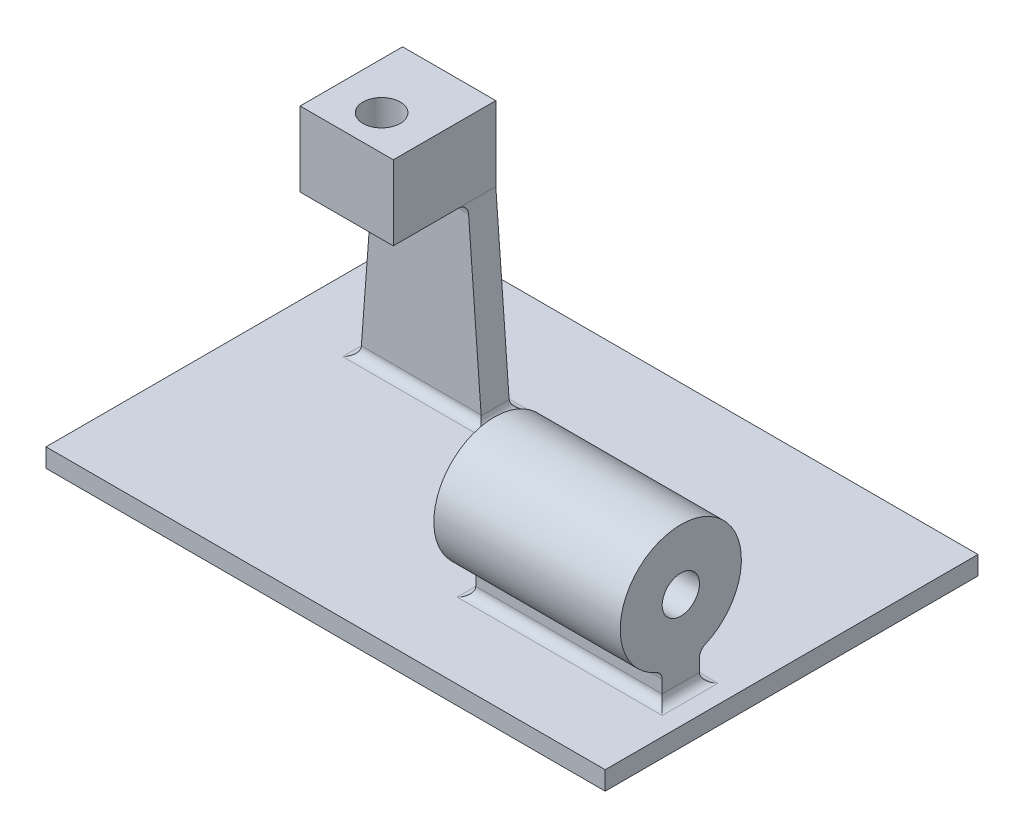
ISO-10303-21;
HEADER;
FILE_DESCRIPTION(('STEP AP214'),'2;1');
FILE_NAME('part.step','',(''),(''),'','','');
FILE_SCHEMA(('AUTOMOTIVE_DESIGN { 1 0 10303 214 1 1 1 1 }'));
ENDSEC;
DATA;
#1=APPLICATION_CONTEXT('core data for automotive mechanical design processes');
#2=APPLICATION_PROTOCOL_DEFINITION('international standard','automotive_design',2000,#1);
#3=PRODUCT_CONTEXT('',#1,'mechanical');
#4=PRODUCT('Part','Part','',(#3));
#5=PRODUCT_RELATED_PRODUCT_CATEGORY('part','',(#4));
#6=PRODUCT_DEFINITION_FORMATION('','',#4);
#7=PRODUCT_DEFINITION_CONTEXT('part definition',#1,'design');
#8=PRODUCT_DEFINITION('design','',#6,#7);
#9=PRODUCT_DEFINITION_SHAPE('','',#8);
#10=(LENGTH_UNIT() NAMED_UNIT(*) SI_UNIT(.MILLI.,.METRE.));
#11=(NAMED_UNIT(*) PLANE_ANGLE_UNIT() SI_UNIT($,.RADIAN.));
#12=(NAMED_UNIT(*) SI_UNIT($,.STERADIAN.) SOLID_ANGLE_UNIT());
#13=UNCERTAINTY_MEASURE_WITH_UNIT(LENGTH_MEASURE(1.E-05),#10,'distance_accuracy_value','');
#14=(GEOMETRIC_REPRESENTATION_CONTEXT(3) GLOBAL_UNCERTAINTY_ASSIGNED_CONTEXT((#13)) GLOBAL_UNIT_ASSIGNED_CONTEXT((#10,
#11,#12)) REPRESENTATION_CONTEXT('',''));
#15=CARTESIAN_POINT('',(0.,0.,0.));
#16=DIRECTION('',(0.,0.,1.));
#17=DIRECTION('',(1.,0.,0.));
#18=AXIS2_PLACEMENT_3D('',#15,#16,#17);
#19=CARTESIAN_POINT('',(0.,0.,-5.30356021786373));
#20=DIRECTION('',(0.,0.,1.));
#21=DIRECTION('',(0.,-1.,0.));
#22=AXIS2_PLACEMENT_3D('',#19,#20,#21);
#23=PLANE('',#22);
#24=DIRECTION('',(0.0747899482416341,-0.997199309888457,0.));
#25=VECTOR('',#24,1.);
#26=CARTESIAN_POINT('',(-10.0406164647511,22.,-5.30356021786373));
#27=LINE('',#26,#25);
#28=CARTESIAN_POINT('',(-9.96561646475105,21.,-5.30356021786373));
#29=VERTEX_POINT('',#28);
#30=CARTESIAN_POINT('',(-8.61561646475106,3.,-5.30356021786373));
#31=VERTEX_POINT('',#30);
#32=EDGE_CURVE('E279',#29,#31,#27,.T.);
#33=ORIENTED_EDGE('',*,*,#32,.F.);
#34=DIRECTION('',(1.,0.,0.));
#35=VECTOR('',#34,1.);
#36=CARTESIAN_POINT('',(0.,21.,-5.30356021786373));
#37=LINE('',#36,#35);
#38=CARTESIAN_POINT('',(-20.115616464751,21.,-5.30356021786373));
#39=VERTEX_POINT('',#38);
#40=EDGE_CURVE('E283',#29,#39,#37,.F.);
#41=ORIENTED_EDGE('',*,*,#40,.T.);
#42=DIRECTION('',(-0.0747899482416345,-0.997199309888457,0.));
#43=VECTOR('',#42,1.);
#44=CARTESIAN_POINT('',(-20.0406164647511,22.,-5.30356021786373));
#45=LINE('',#44,#43);
#46=CARTESIAN_POINT('',(-21.4656164647511,3.,-5.30356021786373));
#47=VERTEX_POINT('',#46);
#48=EDGE_CURVE('E271',#39,#47,#45,.T.);
#49=ORIENTED_EDGE('',*,*,#48,.T.);
#50=DIRECTION('',(1.,0.,0.));
#51=VECTOR('',#50,1.);
#52=CARTESIAN_POINT('',(0.,3.,-5.30356021786373));
#53=LINE('',#52,#51);
#54=EDGE_CURVE('E371',#47,#31,#53,.T.);
#55=ORIENTED_EDGE('',*,*,#54,.T.);
#56=EDGE_LOOP('',(#33,#41,#49,#55));
#57=FACE_BOUND('',#56,.T.);
#58=ADVANCED_FACE('F49',(#57),#23,.T.);
#59=CARTESIAN_POINT('',(30.,2.,20.));
#60=DIRECTION('',(-1.,0.,0.));
#61=DIRECTION('',(0.,0.,1.));
#62=AXIS2_PLACEMENT_3D('',#59,#60,#61);
#63=PLANE('',#62);
#64=DIRECTION('',(0.,0.,-1.));
#65=VECTOR('',#64,1.);
#66=CARTESIAN_POINT('',(30.,0.,20.));
#67=LINE('',#66,#65);
#68=CARTESIAN_POINT('',(30.,0.,20.));
#69=VERTEX_POINT('',#68);
#70=CARTESIAN_POINT('',(30.,0.,-20.));
#71=VERTEX_POINT('',#70);
#72=EDGE_CURVE('E282',#69,#71,#67,.T.);
#73=ORIENTED_EDGE('',*,*,#72,.T.);
#74=DIRECTION('',(0.,-1.,0.));
#75=VECTOR('',#74,1.);
#76=CARTESIAN_POINT('',(30.,2.,-20.));
#77=LINE('',#76,#75);
#78=CARTESIAN_POINT('',(30.,2.,-20.));
#79=VERTEX_POINT('',#78);
#80=EDGE_CURVE('E352',#79,#71,#77,.T.);
#81=ORIENTED_EDGE('',*,*,#80,.F.);
#82=DIRECTION('',(0.,0.,-1.));
#83=VECTOR('',#82,1.);
#84=CARTESIAN_POINT('',(30.,2.,20.));
#85=LINE('',#84,#83);
#86=CARTESIAN_POINT('',(30.,2.,20.));
#87=VERTEX_POINT('',#86);
#88=EDGE_CURVE('E545',#87,#79,#85,.T.);
#89=ORIENTED_EDGE('',*,*,#88,.F.);
#90=DIRECTION('',(0.,-1.,0.));
#91=VECTOR('',#90,1.);
#92=CARTESIAN_POINT('',(30.,2.,20.));
#93=LINE('',#92,#91);
#94=EDGE_CURVE('E737',#87,#69,#93,.T.);
#95=ORIENTED_EDGE('',*,*,#94,.T.);
#96=EDGE_LOOP('',(#73,#81,#89,#95));
#97=FACE_BOUND('',#96,.T.);
#98=ADVANCED_FACE('F558',(#97),#63,.F.);
#99=CARTESIAN_POINT('',(-30.,2.,-20.));
#100=DIRECTION('',(0.,0.,1.));
#101=DIRECTION('',(1.,0.,0.));
#102=AXIS2_PLACEMENT_3D('',#99,#100,#101);
#103=PLANE('',#102);
#104=DIRECTION('',(-1.,0.,0.));
#105=VECTOR('',#104,1.);
#106=CARTESIAN_POINT('',(-30.,0.,-20.));
#107=LINE('',#106,#105);
#108=CARTESIAN_POINT('',(-30.,0.,-20.));
#109=VERTEX_POINT('',#108);
#110=EDGE_CURVE('E724',#71,#109,#107,.T.);
#111=ORIENTED_EDGE('',*,*,#110,.T.);
#112=DIRECTION('',(0.,-1.,0.));
#113=VECTOR('',#112,1.);
#114=CARTESIAN_POINT('',(-30.,2.,-20.));
#115=LINE('',#114,#113);
#116=CARTESIAN_POINT('',(-30.,2.,-20.));
#117=VERTEX_POINT('',#116);
#118=EDGE_CURVE('E562',#117,#109,#115,.T.);
#119=ORIENTED_EDGE('',*,*,#118,.F.);
#120=DIRECTION('',(-1.,0.,0.));
#121=VECTOR('',#120,1.);
#122=CARTESIAN_POINT('',(-30.,2.,-20.));
#123=LINE('',#122,#121);
#124=EDGE_CURVE('E547',#79,#117,#123,.T.);
#125=ORIENTED_EDGE('',*,*,#124,.F.);
#126=ORIENTED_EDGE('',*,*,#80,.T.);
#127=EDGE_LOOP('',(#111,#119,#125,#126));
#128=FACE_BOUND('',#127,.T.);
#129=ADVANCED_FACE('F705',(#128),#103,.F.);
#130=CARTESIAN_POINT('',(-30.,2.,20.));
#131=DIRECTION('',(1.,0.,0.));
#132=DIRECTION('',(0.,0.,-1.));
#133=AXIS2_PLACEMENT_3D('',#130,#131,#132);
#134=PLANE('',#133);
#135=DIRECTION('',(0.,0.,1.));
#136=VECTOR('',#135,1.);
#137=CARTESIAN_POINT('',(-30.,0.,20.));
#138=LINE('',#137,#136);
#139=CARTESIAN_POINT('',(-30.,0.,20.));
#140=VERTEX_POINT('',#139);
#141=EDGE_CURVE('E728',#109,#140,#138,.T.);
#142=ORIENTED_EDGE('',*,*,#141,.T.);
#143=DIRECTION('',(0.,-1.,0.));
#144=VECTOR('',#143,1.);
#145=CARTESIAN_POINT('',(-30.,2.,20.));
#146=LINE('',#145,#144);
#147=CARTESIAN_POINT('',(-30.,2.,20.));
#148=VERTEX_POINT('',#147);
#149=EDGE_CURVE('E566',#148,#140,#146,.T.);
#150=ORIENTED_EDGE('',*,*,#149,.F.);
#151=DIRECTION('',(0.,0.,1.));
#152=VECTOR('',#151,1.);
#153=CARTESIAN_POINT('',(-30.,2.,20.));
#154=LINE('',#153,#152);
#155=EDGE_CURVE('E743',#117,#148,#154,.T.);
#156=ORIENTED_EDGE('',*,*,#155,.F.);
#157=ORIENTED_EDGE('',*,*,#118,.T.);
#158=EDGE_LOOP('',(#142,#150,#156,#157));
#159=FACE_BOUND('',#158,.T.);
#160=ADVANCED_FACE('F710',(#159),#134,.F.);
#161=CARTESIAN_POINT('',(-30.,2.,20.));
#162=DIRECTION('',(0.,0.,-1.));
#163=DIRECTION('',(-1.,0.,0.));
#164=AXIS2_PLACEMENT_3D('',#161,#162,#163);
#165=PLANE('',#164);
#166=DIRECTION('',(1.,0.,0.));
#167=VECTOR('',#166,1.);
#168=CARTESIAN_POINT('',(-30.,0.,20.));
#169=LINE('',#168,#167);
#170=EDGE_CURVE('E555',#140,#69,#169,.T.);
#171=ORIENTED_EDGE('',*,*,#170,.T.);
#172=ORIENTED_EDGE('',*,*,#94,.F.);
#173=DIRECTION('',(1.,0.,0.));
#174=VECTOR('',#173,1.);
#175=CARTESIAN_POINT('',(-30.,2.,20.));
#176=LINE('',#175,#174);
#177=EDGE_CURVE('E550',#148,#87,#176,.T.);
#178=ORIENTED_EDGE('',*,*,#177,.F.);
#179=ORIENTED_EDGE('',*,*,#149,.T.);
#180=EDGE_LOOP('',(#171,#172,#178,#179));
#181=FACE_BOUND('',#180,.T.);
#182=ADVANCED_FACE('F540',(#181),#165,.F.);
#183=CARTESIAN_POINT('',(0.,2.,0.));
#184=DIRECTION('',(0.,-1.,0.));
#185=DIRECTION('',(0.,0.,-1.));
#186=AXIS2_PLACEMENT_3D('',#183,#184,#185);
#187=PLANE('',#186);
#188=DIRECTION('',(1.,0.,0.));
#189=VECTOR('',#188,1.);
#190=CARTESIAN_POINT('',(7.01956756785313,2.,11.9074927082772));
#191=LINE('',#190,#189);
#192=CARTESIAN_POINT('',(28.0195675678531,2.,11.9074927082772));
#193=VERTEX_POINT('',#192);
#194=CARTESIAN_POINT('',(6.01956756785313,2.,11.9074927082772));
#195=VERTEX_POINT('',#194);
#196=EDGE_CURVE('E482',#193,#195,#191,.F.);
#197=ORIENTED_EDGE('',*,*,#196,.T.);
#198=DIRECTION('',(0.,0.,-1.));
#199=VECTOR('',#198,1.);
#200=CARTESIAN_POINT('',(6.01956756785313,2.,0.));
#201=LINE('',#200,#199);
#202=CARTESIAN_POINT('',(6.01956756785313,2.,5.90749270827718));
#203=VERTEX_POINT('',#202);
#204=EDGE_CURVE('E459',#195,#203,#201,.T.);
#205=ORIENTED_EDGE('',*,*,#204,.T.);
#206=DIRECTION('',(1.,0.,0.));
#207=VECTOR('',#206,1.);
#208=CARTESIAN_POINT('',(0.,2.,5.90749270827718));
#209=LINE('',#208,#207);
#210=CARTESIAN_POINT('',(28.0195675678531,2.,5.90749270827718));
#211=VERTEX_POINT('',#210);
#212=EDGE_CURVE('E466',#203,#211,#209,.T.);
#213=ORIENTED_EDGE('',*,*,#212,.T.);
#214=DIRECTION('',(0.,0.,-1.));
#215=VECTOR('',#214,1.);
#216=CARTESIAN_POINT('',(28.0195675678531,2.,10.9074927082772));
#217=LINE('',#216,#215);
#218=EDGE_CURVE('E487',#211,#193,#217,.F.);
#219=ORIENTED_EDGE('',*,*,#218,.T.);
#220=EDGE_LOOP('',(#197,#205,#213,#219));
#221=FACE_BOUND('',#220,.T.);
#222=DIRECTION('',(0.,0.,1.));
#223=VECTOR('',#222,1.);
#224=CARTESIAN_POINT('',(-22.4684250207576,2.,0.));
#225=LINE('',#224,#223);
#226=CARTESIAN_POINT('',(-22.4684250207576,2.,-4.30356021786373));
#227=VERTEX_POINT('',#226);
#228=CARTESIAN_POINT('',(-22.4684250207576,2.,-9.30356021786373));
#229=VERTEX_POINT('',#228);
#230=EDGE_CURVE('E358',#227,#229,#225,.F.);
#231=ORIENTED_EDGE('',*,*,#230,.T.);
#232=DIRECTION('',(-1.,0.,0.));
#233=VECTOR('',#232,1.);
#234=CARTESIAN_POINT('',(0.,2.,-9.30356021786373));
#235=LINE('',#234,#233);
#236=CARTESIAN_POINT('',(-7.61280790874448,2.,-9.30356021786373));
#237=VERTEX_POINT('',#236);
#238=EDGE_CURVE('E361',#229,#237,#235,.F.);
#239=ORIENTED_EDGE('',*,*,#238,.T.);
#240=DIRECTION('',(0.,0.,-1.));
#241=VECTOR('',#240,1.);
#242=CARTESIAN_POINT('',(-7.61280790874448,2.,0.));
#243=LINE('',#242,#241);
#244=CARTESIAN_POINT('',(-7.61280790874448,2.,-4.30356021786373));
#245=VERTEX_POINT('',#244);
#246=EDGE_CURVE('E355',#237,#245,#243,.F.);
#247=ORIENTED_EDGE('',*,*,#246,.T.);
#248=DIRECTION('',(1.,0.,0.));
#249=VECTOR('',#248,1.);
#250=CARTESIAN_POINT('',(0.,2.,-4.30356021786373));
#251=LINE('',#250,#249);
#252=EDGE_CURVE('E351',#245,#227,#251,.F.);
#253=ORIENTED_EDGE('',*,*,#252,.T.);
#254=EDGE_LOOP('',(#231,#239,#247,#253));
#255=FACE_BOUND('',#254,.T.);
#256=ORIENTED_EDGE('',*,*,#88,.T.);
#257=ORIENTED_EDGE('',*,*,#124,.T.);
#258=ORIENTED_EDGE('',*,*,#155,.T.);
#259=ORIENTED_EDGE('',*,*,#177,.T.);
#260=EDGE_LOOP('',(#256,#257,#258,#259));
#261=FACE_BOUND('',#260,.T.);
#262=ADVANCED_FACE('F312',(#221,#255,#261),#187,.F.);
#263=CARTESIAN_POINT('',(0.,0.,0.));
#264=DIRECTION('',(0.,-1.,0.));
#265=DIRECTION('',(0.,0.,-1.));
#266=AXIS2_PLACEMENT_3D('',#263,#264,#265);
#267=PLANE('',#266);
#268=ORIENTED_EDGE('',*,*,#72,.F.);
#269=ORIENTED_EDGE('',*,*,#170,.F.);
#270=ORIENTED_EDGE('',*,*,#141,.F.);
#271=ORIENTED_EDGE('',*,*,#110,.F.);
#272=EDGE_LOOP('',(#268,#269,#270,#271));
#273=FACE_BOUND('',#272,.T.);
#274=ADVANCED_FACE('F539',(#273),#267,.T.);
#275=CARTESIAN_POINT('',(-21.5692892129283,1.61769669096963,0.));
#276=DIRECTION('',(-0.997199309888457,0.0747899482416345,0.));
#277=DIRECTION('',(-0.0747899482416345,-0.997199309888457,0.));
#278=AXIS2_PLACEMENT_3D('',#275,#276,#277);
#279=PLANE('',#278);
#280=CARTESIAN_POINT('',(-21.4656164647511,3.,-9.30356021786373));
#281=DIRECTION('',(-0.997199309888457,0.0747899482416345,0.));
#282=DIRECTION('',(-0.0747899482416345,-0.997199309888457,0.));
#283=AXIS2_PLACEMENT_3D('',#280,#281,#282);
#284=ELLIPSE('',#283,1.00280855600658,1.);
#285=CARTESIAN_POINT('',(-21.4656164647511,3.,-8.30356021786373));
#286=VERTEX_POINT('',#285);
#287=CARTESIAN_POINT('',(-21.4712257108692,2.92521005175837,-8.30636090797527));
#288=VERTEX_POINT('',#287);
#289=EDGE_CURVE('E375',#286,#288,#284,.F.);
#290=ORIENTED_EDGE('',*,*,#289,.T.);
#291=DIRECTION('',(0.,0.,1.));
#292=VECTOR('',#291,1.);
#293=CARTESIAN_POINT('',(-21.4712257108692,2.92521005175837,0.));
#294=LINE('',#293,#292);
#295=CARTESIAN_POINT('',(-21.4712257108692,2.92521005175837,-5.30075952775218));
#296=VERTEX_POINT('',#295);
#297=EDGE_CURVE('E365',#288,#296,#294,.T.);
#298=ORIENTED_EDGE('',*,*,#297,.T.);
#299=CARTESIAN_POINT('',(-21.4656164647511,3.,-4.30356021786373));
#300=DIRECTION('',(-0.997199309888457,0.0747899482416345,0.));
#301=DIRECTION('',(0.0747899482416345,0.997199309888457,0.));
#302=AXIS2_PLACEMENT_3D('',#299,#300,#301);
#303=ELLIPSE('',#302,1.00280855600658,1.);
#304=EDGE_CURVE('E386',#296,#47,#303,.F.);
#305=ORIENTED_EDGE('',*,*,#304,.T.);
#306=ORIENTED_EDGE('',*,*,#48,.F.);
#307=CARTESIAN_POINT('',(-20.1156164647511,21.,-4.30356021786373));
#308=DIRECTION('',(-0.997199309888457,0.0747899482416345,0.));
#309=DIRECTION('',(0.0747899482416345,0.997199309888457,0.));
#310=AXIS2_PLACEMENT_3D('',#307,#308,#309);
#311=ELLIPSE('',#310,1.00280855600658,1.);
#312=CARTESIAN_POINT('',(-20.0406164647511,22.,-4.30356021786373));
#313=VERTEX_POINT('',#312);
#314=EDGE_CURVE('E605',#39,#313,#311,.F.);
#315=ORIENTED_EDGE('',*,*,#314,.T.);
#316=CARTESIAN_POINT('',(-20.0406164647511,22.,-5.30356021786373));
#317=DIRECTION('',(0.,0.,1.));
#318=VECTOR('',#317,1.);
#319=LINE('',#316,#318);
#320=CARTESIAN_POINT('',(-20.0406164647511,22.,-5.30356021786373));
#321=VERTEX_POINT('',#320);
#322=EDGE_CURVE('E514',#321,#313,#319,.T.);
#323=ORIENTED_EDGE('',*,*,#322,.F.);
#324=DIRECTION('',(0.,0.,1.));
#325=VECTOR('',#324,1.);
#326=CARTESIAN_POINT('',(-20.0406164647511,22.,-5.30356021786373));
#327=LINE('',#326,#325);
#328=CARTESIAN_POINT('',(-20.0406164647511,22.,-8.30356021786373));
#329=VERTEX_POINT('',#328);
#330=EDGE_CURVE('E331',#329,#321,#327,.T.);
#331=ORIENTED_EDGE('',*,*,#330,.F.);
#332=DIRECTION('',(-0.0747899482416345,-0.997199309888457,0.));
#333=VECTOR('',#332,1.);
#334=CARTESIAN_POINT('',(-20.0406164647511,22.,-8.30356021786373));
#335=LINE('',#334,#333);
#336=EDGE_CURVE('E276',#329,#286,#335,.T.);
#337=ORIENTED_EDGE('',*,*,#336,.T.);
#338=EDGE_LOOP('',(#290,#298,#305,#306,#315,#323,#331,#337));
#339=FACE_BOUND('',#338,.T.);
#340=ADVANCED_FACE('F606',(#339),#279,.T.);
#341=CARTESIAN_POINT('',(0.,0.,-8.30356021786373));
#342=DIRECTION('',(0.,0.,-1.));
#343=DIRECTION('',(-1.,0.,0.));
#344=AXIS2_PLACEMENT_3D('',#341,#342,#343);
#345=PLANE('',#344);
#346=DIRECTION('',(0.0747899482416341,-0.997199309888457,0.));
#347=VECTOR('',#346,1.);
#348=CARTESIAN_POINT('',(-10.0406164647511,22.,-8.30356021786373));
#349=LINE('',#348,#347);
#350=CARTESIAN_POINT('',(-10.0406164647511,22.,-8.30356021786373));
#351=VERTEX_POINT('',#350);
#352=CARTESIAN_POINT('',(-8.61561646475106,3.,-8.30356021786373));
#353=VERTEX_POINT('',#352);
#354=EDGE_CURVE('E275',#351,#353,#349,.T.);
#355=ORIENTED_EDGE('',*,*,#354,.T.);
#356=DIRECTION('',(-1.,0.,0.));
#357=VECTOR('',#356,1.);
#358=CARTESIAN_POINT('',(0.,3.,-8.30356021786373));
#359=LINE('',#358,#357);
#360=EDGE_CURVE('E347',#353,#286,#359,.T.);
#361=ORIENTED_EDGE('',*,*,#360,.T.);
#362=ORIENTED_EDGE('',*,*,#336,.F.);
#363=DIRECTION('',(0.,-1.,0.));
#364=VECTOR('',#363,1.);
#365=CARTESIAN_POINT('',(-20.0406164647511,30.,-8.30356021786373));
#366=LINE('',#365,#364);
#367=CARTESIAN_POINT('',(-20.0406164647511,30.,-8.30356021786373));
#368=VERTEX_POINT('',#367);
#369=EDGE_CURVE('E230',#368,#329,#366,.T.);
#370=ORIENTED_EDGE('',*,*,#369,.F.);
#371=DIRECTION('',(-1.,0.,0.));
#372=VECTOR('',#371,1.);
#373=CARTESIAN_POINT('',(-20.0406164647511,30.,-8.30356021786373));
#374=LINE('',#373,#372);
#375=CARTESIAN_POINT('',(-10.0406164647511,30.,-8.30356021786373));
#376=VERTEX_POINT('',#375);
#377=EDGE_CURVE('E224',#376,#368,#374,.T.);
#378=ORIENTED_EDGE('',*,*,#377,.F.);
#379=DIRECTION('',(0.,-1.,0.));
#380=VECTOR('',#379,1.);
#381=CARTESIAN_POINT('',(-10.0406164647511,30.,-8.30356021786373));
#382=LINE('',#381,#380);
#383=EDGE_CURVE('E346',#376,#351,#382,.T.);
#384=ORIENTED_EDGE('',*,*,#383,.T.);
#385=EDGE_LOOP('',(#355,#361,#362,#370,#378,#384));
#386=FACE_BOUND('',#385,.T.);
#387=ADVANCED_FACE('F310',(#386),#345,.T.);
#388=CARTESIAN_POINT('',(-8.34368324648956,-0.625776243486716,0.));
#389=DIRECTION('',(0.997199309888457,0.0747899482416341,0.));
#390=DIRECTION('',(-0.0747899482416341,0.997199309888457,0.));
#391=AXIS2_PLACEMENT_3D('',#388,#389,#390);
#392=PLANE('',#391);
#393=DIRECTION('',(0.,0.,-1.));
#394=VECTOR('',#393,1.);
#395=CARTESIAN_POINT('',(-10.0406164647511,22.,-5.30356021786373));
#396=LINE('',#395,#394);
#397=CARTESIAN_POINT('',(-10.0406164647511,22.,-5.30356021786373));
#398=VERTEX_POINT('',#397);
#399=EDGE_CURVE('E335',#398,#351,#396,.T.);
#400=ORIENTED_EDGE('',*,*,#399,.F.);
#401=CARTESIAN_POINT('',(-10.0406164647511,22.,-5.30356021786373));
#402=DIRECTION('',(0.,0.,1.));
#403=VECTOR('',#402,1.);
#404=LINE('',#401,#403);
#405=CARTESIAN_POINT('',(-10.0406164647511,22.,-4.30356021786373));
#406=VERTEX_POINT('',#405);
#407=EDGE_CURVE('E292',#398,#406,#404,.T.);
#408=ORIENTED_EDGE('',*,*,#407,.T.);
#409=CARTESIAN_POINT('',(-9.96561646475106,21.,-4.30356021786373));
#410=DIRECTION('',(0.997199309888457,0.0747899482416341,0.));
#411=DIRECTION('',(0.0747899482416341,-0.997199309888457,0.));
#412=AXIS2_PLACEMENT_3D('',#409,#410,#411);
#413=ELLIPSE('',#412,1.00280855600658,1.);
#414=EDGE_CURVE('E286',#406,#29,#413,.F.);
#415=ORIENTED_EDGE('',*,*,#414,.T.);
#416=ORIENTED_EDGE('',*,*,#32,.T.);
#417=CARTESIAN_POINT('',(-8.61561646475106,3.,-4.30356021786373));
#418=DIRECTION('',(0.997199309888457,0.0747899482416341,0.));
#419=DIRECTION('',(0.0747899482416341,-0.997199309888457,0.));
#420=AXIS2_PLACEMENT_3D('',#417,#418,#419);
#421=ELLIPSE('',#420,1.00280855600658,1.);
#422=CARTESIAN_POINT('',(-8.61000721863294,2.92521005175837,-5.30075952775218));
#423=VERTEX_POINT('',#422);
#424=EDGE_CURVE('E382',#31,#423,#421,.F.);
#425=ORIENTED_EDGE('',*,*,#424,.T.);
#426=DIRECTION('',(0.,0.,-1.));
#427=VECTOR('',#426,1.);
#428=CARTESIAN_POINT('',(-8.61000721863294,2.92521005175837,0.));
#429=LINE('',#428,#427);
#430=CARTESIAN_POINT('',(-8.61000721863294,2.92521005175837,-8.30636090797527));
#431=VERTEX_POINT('',#430);
#432=EDGE_CURVE('E368',#423,#431,#429,.T.);
#433=ORIENTED_EDGE('',*,*,#432,.T.);
#434=CARTESIAN_POINT('',(-8.61561646475106,3.,-9.30356021786373));
#435=DIRECTION('',(0.997199309888457,0.0747899482416341,0.));
#436=DIRECTION('',(-0.0747899482416341,0.997199309888457,0.));
#437=AXIS2_PLACEMENT_3D('',#434,#435,#436);
#438=ELLIPSE('',#437,1.00280855600658,1.);
#439=EDGE_CURVE('E379',#431,#353,#438,.F.);
#440=ORIENTED_EDGE('',*,*,#439,.T.);
#441=ORIENTED_EDGE('',*,*,#354,.F.);
#442=EDGE_LOOP('',(#400,#408,#415,#416,#425,#433,#440,#441));
#443=FACE_BOUND('',#442,.T.);
#444=ADVANCED_FACE('F299',(#443),#392,.T.);
#445=CARTESIAN_POINT('',(-10.0406164647511,30.,-5.30356021786373));
#446=DIRECTION('',(-1.,0.,0.));
#447=DIRECTION('',(0.,0.,1.));
#448=AXIS2_PLACEMENT_3D('',#445,#446,#447);
#449=PLANE('',#448);
#450=ORIENTED_EDGE('',*,*,#399,.T.);
#451=ORIENTED_EDGE('',*,*,#383,.F.);
#452=DIRECTION('',(0.,0.,-1.));
#453=VECTOR('',#452,1.);
#454=CARTESIAN_POINT('',(-10.0406164647511,30.,-5.30356021786373));
#455=LINE('',#454,#453);
#456=CARTESIAN_POINT('',(-10.0406164647511,30.,2.69643978213628));
#457=VERTEX_POINT('',#456);
#458=EDGE_CURVE('E261',#457,#376,#455,.T.);
#459=ORIENTED_EDGE('',*,*,#458,.F.);
#460=DIRECTION('',(0.,1.,0.));
#461=VECTOR('',#460,1.);
#462=CARTESIAN_POINT('',(-10.0406164647511,22.,2.69643978213628));
#463=LINE('',#462,#461);
#464=CARTESIAN_POINT('',(-10.0406164647511,22.,2.69643978213628));
#465=VERTEX_POINT('',#464);
#466=EDGE_CURVE('E238',#465,#457,#463,.T.);
#467=ORIENTED_EDGE('',*,*,#466,.F.);
#468=DIRECTION('',(0.,0.,-1.));
#469=VECTOR('',#468,1.);
#470=CARTESIAN_POINT('',(-10.0406164647511,22.,2.69643978213628));
#471=LINE('',#470,#469);
#472=EDGE_CURVE('E260',#465,#406,#471,.T.);
#473=ORIENTED_EDGE('',*,*,#472,.T.);
#474=ORIENTED_EDGE('',*,*,#407,.F.);
#475=EDGE_LOOP('',(#450,#451,#459,#467,#473,#474));
#476=FACE_BOUND('',#475,.T.);
#477=ADVANCED_FACE('F309',(#476),#449,.F.);
#478=CARTESIAN_POINT('',(-20.0406164647511,30.,-5.30356021786373));
#479=DIRECTION('',(1.,0.,0.));
#480=DIRECTION('',(0.,0.,-1.));
#481=AXIS2_PLACEMENT_3D('',#478,#479,#480);
#482=PLANE('',#481);
#483=ORIENTED_EDGE('',*,*,#330,.T.);
#484=ORIENTED_EDGE('',*,*,#322,.T.);
#485=DIRECTION('',(0.,0.,-1.));
#486=VECTOR('',#485,1.);
#487=CARTESIAN_POINT('',(-20.0406164647511,22.,2.69643978213628));
#488=LINE('',#487,#486);
#489=CARTESIAN_POINT('',(-20.0406164647511,22.,2.69643978213628));
#490=VERTEX_POINT('',#489);
#491=EDGE_CURVE('E244',#490,#313,#488,.T.);
#492=ORIENTED_EDGE('',*,*,#491,.F.);
#493=DIRECTION('',(0.,1.,0.));
#494=VECTOR('',#493,1.);
#495=CARTESIAN_POINT('',(-20.0406164647511,22.,2.69643978213628));
#496=LINE('',#495,#494);
#497=CARTESIAN_POINT('',(-20.0406164647511,30.,2.69643978213628));
#498=VERTEX_POINT('',#497);
#499=EDGE_CURVE('E236',#490,#498,#496,.T.);
#500=ORIENTED_EDGE('',*,*,#499,.T.);
#501=DIRECTION('',(0.,0.,1.));
#502=VECTOR('',#501,1.);
#503=CARTESIAN_POINT('',(-20.0406164647511,30.,-5.30356021786373));
#504=LINE('',#503,#502);
#505=EDGE_CURVE('E219',#368,#498,#504,.T.);
#506=ORIENTED_EDGE('',*,*,#505,.F.);
#507=ORIENTED_EDGE('',*,*,#369,.T.);
#508=EDGE_LOOP('',(#483,#484,#492,#500,#506,#507));
#509=FACE_BOUND('',#508,.T.);
#510=ADVANCED_FACE('F242',(#509),#482,.F.);
#511=CARTESIAN_POINT('',(0.,30.,0.));
#512=DIRECTION('',(0.,-1.,0.));
#513=DIRECTION('',(0.,0.,-1.));
#514=AXIS2_PLACEMENT_3D('',#511,#512,#513);
#515=PLANE('',#514);
#516=CARTESIAN_POINT('',(-15.0406164647511,30.,-1.0488380275618));
#517=DIRECTION('',(0.,1.,0.));
#518=DIRECTION('',(0.,0.,1.));
#519=AXIS2_PLACEMENT_3D('',#516,#517,#518);
#520=CIRCLE('',#519,2.);
#521=CARTESIAN_POINT('',(-15.0406164647511,30.,0.951161972438196));
#522=VERTEX_POINT('',#521);
#523=EDGE_CURVE('E251',#522,#522,#520,.T.);
#524=ORIENTED_EDGE('',*,*,#523,.F.);
#525=EDGE_LOOP('',(#524));
#526=FACE_BOUND('',#525,.T.);
#527=ORIENTED_EDGE('',*,*,#458,.T.);
#528=ORIENTED_EDGE('',*,*,#377,.T.);
#529=ORIENTED_EDGE('',*,*,#505,.T.);
#530=DIRECTION('',(1.,0.,0.));
#531=VECTOR('',#530,1.);
#532=CARTESIAN_POINT('',(-20.0406164647511,30.,2.69643978213628));
#533=LINE('',#532,#531);
#534=EDGE_CURVE('E223',#498,#457,#533,.T.);
#535=ORIENTED_EDGE('',*,*,#534,.T.);
#536=EDGE_LOOP('',(#527,#528,#529,#535));
#537=FACE_BOUND('',#536,.T.);
#538=ADVANCED_FACE('F222',(#526,#537),#515,.F.);
#539=CARTESIAN_POINT('',(-20.0406164647511,22.,2.69643978213628));
#540=DIRECTION('',(0.,1.,0.));
#541=DIRECTION('',(0.,0.,1.));
#542=AXIS2_PLACEMENT_3D('',#539,#540,#541);
#543=PLANE('',#542);
#544=CARTESIAN_POINT('',(-15.0406164647511,22.,-1.0488380275618));
#545=DIRECTION('',(0.,1.,0.));
#546=DIRECTION('',(0.,0.,1.));
#547=AXIS2_PLACEMENT_3D('',#544,#545,#546);
#548=CIRCLE('',#547,2.);
#549=CARTESIAN_POINT('',(-15.0406164647511,22.,0.951161972438196));
#550=VERTEX_POINT('',#549);
#551=EDGE_CURVE('E247',#550,#550,#548,.T.);
#552=ORIENTED_EDGE('',*,*,#551,.T.);
#553=EDGE_LOOP('',(#552));
#554=FACE_BOUND('',#553,.T.);
#555=ORIENTED_EDGE('',*,*,#491,.T.);
#556=DIRECTION('',(1.,0.,0.));
#557=VECTOR('',#556,1.);
#558=CARTESIAN_POINT('',(-20.0406164647511,22.,-4.30356021786373));
#559=LINE('',#558,#557);
#560=EDGE_CURVE('E287',#313,#406,#559,.T.);
#561=ORIENTED_EDGE('',*,*,#560,.T.);
#562=ORIENTED_EDGE('',*,*,#472,.F.);
#563=DIRECTION('',(1.,0.,0.));
#564=VECTOR('',#563,1.);
#565=CARTESIAN_POINT('',(-20.0406164647511,22.,2.69643978213628));
#566=LINE('',#565,#564);
#567=EDGE_CURVE('E257',#490,#465,#566,.T.);
#568=ORIENTED_EDGE('',*,*,#567,.F.);
#569=EDGE_LOOP('',(#555,#561,#562,#568));
#570=FACE_BOUND('',#569,.T.);
#571=ADVANCED_FACE('F660',(#554,#570),#543,.F.);
#572=CARTESIAN_POINT('',(0.,0.,2.69643978213628));
#573=DIRECTION('',(0.,0.,-1.));
#574=DIRECTION('',(-1.,0.,0.));
#575=AXIS2_PLACEMENT_3D('',#572,#573,#574);
#576=PLANE('',#575);
#577=ORIENTED_EDGE('',*,*,#499,.F.);
#578=ORIENTED_EDGE('',*,*,#567,.T.);
#579=ORIENTED_EDGE('',*,*,#466,.T.);
#580=ORIENTED_EDGE('',*,*,#534,.F.);
#581=EDGE_LOOP('',(#577,#578,#579,#580));
#582=FACE_BOUND('',#581,.T.);
#583=ADVANCED_FACE('F235',(#582),#576,.F.);
#584=CARTESIAN_POINT('',(-15.0406164647511,22.,-1.0488380275618));
#585=DIRECTION('',(0.,1.,0.));
#586=DIRECTION('',(0.,0.,1.));
#587=AXIS2_PLACEMENT_3D('',#584,#585,#586);
#588=CYLINDRICAL_SURFACE('',#587,2.);
#589=ORIENTED_EDGE('',*,*,#551,.F.);
#590=EDGE_LOOP('',(#589));
#591=FACE_BOUND('',#590,.T.);
#592=ORIENTED_EDGE('',*,*,#523,.T.);
#593=EDGE_LOOP('',(#592));
#594=FACE_BOUND('',#593,.T.);
#595=ADVANCED_FACE('F795',(#591,#594),#588,.F.);
#596=CARTESIAN_POINT('',(7.01956756785313,6.,10.9074927082772));
#597=DIRECTION('',(-1.,0.,0.));
#598=DIRECTION('',(0.,0.,1.));
#599=AXIS2_PLACEMENT_3D('',#596,#597,#598);
#600=PLANE('',#599);
#601=DIRECTION('',(0.,-1.,0.));
#602=VECTOR('',#601,1.);
#603=CARTESIAN_POINT('',(7.01956756785313,6.,6.90749270827718));
#604=LINE('',#603,#602);
#605=CARTESIAN_POINT('',(7.01956756785313,4.36417277897925,6.90749270827718));
#606=VERTEX_POINT('',#605);
#607=CARTESIAN_POINT('',(7.01956756785313,3.,6.90749270827718));
#608=VERTEX_POINT('',#607);
#609=EDGE_CURVE('E423',#606,#608,#604,.T.);
#610=ORIENTED_EDGE('',*,*,#609,.T.);
#611=DIRECTION('',(0.,0.,-1.));
#612=VECTOR('',#611,1.);
#613=CARTESIAN_POINT('',(7.01956756785313,3.,10.9074927082772));
#614=LINE('',#613,#612);
#615=CARTESIAN_POINT('',(7.01956756785313,3.,10.9074927082772));
#616=VERTEX_POINT('',#615);
#617=EDGE_CURVE('E445',#608,#616,#614,.F.);
#618=ORIENTED_EDGE('',*,*,#617,.T.);
#619=DIRECTION('',(0.,-1.,0.));
#620=VECTOR('',#619,1.);
#621=CARTESIAN_POINT('',(7.01956756785313,6.,10.9074927082772));
#622=LINE('',#621,#620);
#623=CARTESIAN_POINT('',(7.01956756785313,4.36417277897925,10.9074927082772));
#624=VERTEX_POINT('',#623);
#625=EDGE_CURVE('E426',#624,#616,#622,.T.);
#626=ORIENTED_EDGE('',*,*,#625,.F.);
#627=CARTESIAN_POINT('',(7.01956756785313,4.36417277897925,11.9074927082772));
#628=DIRECTION('',(-1.,0.,0.));
#629=DIRECTION('',(0.,0.,1.));
#630=AXIS2_PLACEMENT_3D('',#627,#628,#629);
#631=CIRCLE('',#630,1.);
#632=CARTESIAN_POINT('',(7.01956756785313,5.28068791797042,11.5074927082772));
#633=VERTEX_POINT('',#632);
#634=EDGE_CURVE('E59',#624,#633,#631,.F.);
#635=ORIENTED_EDGE('',*,*,#634,.T.);
#636=CARTESIAN_POINT('',(7.01956756785313,11.238036321413,8.90749270827718));
#637=DIRECTION('',(1.,0.,0.));
#638=DIRECTION('',(0.,0.,-1.));
#639=AXIS2_PLACEMENT_3D('',#636,#637,#638);
#640=CIRCLE('',#639,6.5);
#641=CARTESIAN_POINT('',(7.01956756785313,5.28068791797042,6.30749270827718));
#642=VERTEX_POINT('',#641);
#643=EDGE_CURVE('E419',#642,#633,#640,.T.);
#644=ORIENTED_EDGE('',*,*,#643,.F.);
#645=CARTESIAN_POINT('',(7.01956756785313,4.36417277897925,5.90749270827718));
#646=DIRECTION('',(-1.,0.,0.));
#647=DIRECTION('',(0.,0.,1.));
#648=AXIS2_PLACEMENT_3D('',#645,#646,#647);
#649=CIRCLE('',#648,1.);
#650=EDGE_CURVE('E447',#642,#606,#649,.F.);
#651=ORIENTED_EDGE('',*,*,#650,.T.);
#652=EDGE_LOOP('',(#610,#618,#626,#635,#644,#651));
#653=FACE_BOUND('',#652,.T.);
#654=CARTESIAN_POINT('',(7.01956756785313,11.238036321413,8.90749270827718));
#655=DIRECTION('',(1.,0.,0.));
#656=DIRECTION('',(0.,0.,-1.));
#657=AXIS2_PLACEMENT_3D('',#654,#655,#656);
#658=CIRCLE('',#657,2.);
#659=CARTESIAN_POINT('',(7.01956756785313,11.238036321413,6.90749270827718));
#660=VERTEX_POINT('',#659);
#661=EDGE_CURVE('E410',#660,#660,#658,.T.);
#662=ORIENTED_EDGE('',*,*,#661,.T.);
#663=EDGE_LOOP('',(#662));
#664=FACE_BOUND('',#663,.T.);
#665=ADVANCED_FACE('F442',(#653,#664),#600,.T.);
#666=CARTESIAN_POINT('',(7.01956756785313,6.,10.9074927082772));
#667=DIRECTION('',(0.,0.,-1.));
#668=DIRECTION('',(-1.,0.,0.));
#669=AXIS2_PLACEMENT_3D('',#666,#667,#668);
#670=PLANE('',#669);
#671=DIRECTION('',(0.,-1.,0.));
#672=VECTOR('',#671,1.);
#673=CARTESIAN_POINT('',(27.0195675678531,6.,10.9074927082772));
#674=LINE('',#673,#672);
#675=CARTESIAN_POINT('',(27.0195675678531,4.36417277897925,10.9074927082772));
#676=VERTEX_POINT('',#675);
#677=CARTESIAN_POINT('',(27.0195675678531,3.,10.9074927082772));
#678=VERTEX_POINT('',#677);
#679=EDGE_CURVE('E429',#676,#678,#674,.T.);
#680=ORIENTED_EDGE('',*,*,#679,.F.);
#681=DIRECTION('',(1.,0.,0.));
#682=VECTOR('',#681,1.);
#683=CARTESIAN_POINT('',(7.01956756785313,4.36417277897925,10.9074927082772));
#684=LINE('',#683,#682);
#685=EDGE_CURVE('E491',#676,#624,#684,.F.);
#686=ORIENTED_EDGE('',*,*,#685,.T.);
#687=ORIENTED_EDGE('',*,*,#625,.T.);
#688=DIRECTION('',(1.,0.,0.));
#689=VECTOR('',#688,1.);
#690=CARTESIAN_POINT('',(27.0195675678531,3.,10.9074927082772));
#691=LINE('',#690,#689);
#692=EDGE_CURVE('E67',#616,#678,#691,.T.);
#693=ORIENTED_EDGE('',*,*,#692,.T.);
#694=EDGE_LOOP('',(#680,#686,#687,#693));
#695=FACE_BOUND('',#694,.T.);
#696=ADVANCED_FACE('F808',(#695),#670,.F.);
#697=CARTESIAN_POINT('',(27.0195675678531,6.,10.9074927082772));
#698=DIRECTION('',(-1.,0.,0.));
#699=DIRECTION('',(0.,0.,1.));
#700=AXIS2_PLACEMENT_3D('',#697,#698,#699);
#701=PLANE('',#700);
#702=ORIENTED_EDGE('',*,*,#679,.T.);
#703=DIRECTION('',(0.,0.,-1.));
#704=VECTOR('',#703,1.);
#705=CARTESIAN_POINT('',(27.0195675678531,3.,6.90749270827718));
#706=LINE('',#705,#704);
#707=CARTESIAN_POINT('',(27.0195675678531,3.,6.90749270827718));
#708=VERTEX_POINT('',#707);
#709=EDGE_CURVE('E488',#678,#708,#706,.T.);
#710=ORIENTED_EDGE('',*,*,#709,.T.);
#711=DIRECTION('',(0.,-1.,0.));
#712=VECTOR('',#711,1.);
#713=CARTESIAN_POINT('',(27.0195675678531,6.,6.90749270827718));
#714=LINE('',#713,#712);
#715=CARTESIAN_POINT('',(27.0195675678531,4.36417277897925,6.90749270827718));
#716=VERTEX_POINT('',#715);
#717=EDGE_CURVE('E432',#716,#708,#714,.T.);
#718=ORIENTED_EDGE('',*,*,#717,.F.);
#719=CARTESIAN_POINT('',(27.0195675678531,4.36417277897925,5.90749270827718));
#720=DIRECTION('',(-1.,0.,0.));
#721=DIRECTION('',(0.,0.,1.));
#722=AXIS2_PLACEMENT_3D('',#719,#720,#721);
#723=CIRCLE('',#722,1.);
#724=CARTESIAN_POINT('',(27.0195675678531,5.28068791797042,6.30749270827718));
#725=VERTEX_POINT('',#724);
#726=EDGE_CURVE('E495',#716,#725,#723,.T.);
#727=ORIENTED_EDGE('',*,*,#726,.T.);
#728=CARTESIAN_POINT('',(27.0195675678531,11.238036321413,8.90749270827718));
#729=DIRECTION('',(1.,0.,0.));
#730=DIRECTION('',(0.,0.,-1.));
#731=AXIS2_PLACEMENT_3D('',#728,#729,#730);
#732=CIRCLE('',#731,6.5);
#733=CARTESIAN_POINT('',(27.0195675678531,5.28068791797042,11.5074927082772));
#734=VERTEX_POINT('',#733);
#735=EDGE_CURVE('E416',#725,#734,#732,.T.);
#736=ORIENTED_EDGE('',*,*,#735,.T.);
#737=CARTESIAN_POINT('',(27.0195675678531,4.36417277897925,11.9074927082772));
#738=DIRECTION('',(-1.,0.,0.));
#739=DIRECTION('',(0.,0.,1.));
#740=AXIS2_PLACEMENT_3D('',#737,#738,#739);
#741=CIRCLE('',#740,1.);
#742=EDGE_CURVE('E12',#734,#676,#741,.T.);
#743=ORIENTED_EDGE('',*,*,#742,.T.);
#744=EDGE_LOOP('',(#702,#710,#718,#727,#736,#743));
#745=FACE_BOUND('',#744,.T.);
#746=CARTESIAN_POINT('',(27.0195675678531,11.238036321413,8.90749270827718));
#747=DIRECTION('',(1.,0.,0.));
#748=DIRECTION('',(0.,0.,-1.));
#749=AXIS2_PLACEMENT_3D('',#746,#747,#748);
#750=CIRCLE('',#749,2.);
#751=CARTESIAN_POINT('',(27.0195675678531,11.238036321413,6.90749270827718));
#752=VERTEX_POINT('',#751);
#753=EDGE_CURVE('E404',#752,#752,#750,.T.);
#754=ORIENTED_EDGE('',*,*,#753,.F.);
#755=EDGE_LOOP('',(#754));
#756=FACE_BOUND('',#755,.T.);
#757=ADVANCED_FACE('F816',(#745,#756),#701,.F.);
#758=CARTESIAN_POINT('',(7.01956756785313,6.,6.90749270827718));
#759=DIRECTION('',(0.,0.,-1.));
#760=DIRECTION('',(-1.,0.,0.));
#761=AXIS2_PLACEMENT_3D('',#758,#759,#760);
#762=PLANE('',#761);
#763=ORIENTED_EDGE('',*,*,#609,.F.);
#764=DIRECTION('',(-1.,0.,0.));
#765=VECTOR('',#764,1.);
#766=CARTESIAN_POINT('',(27.0195675678531,4.36417277897925,6.90749270827718));
#767=LINE('',#766,#765);
#768=EDGE_CURVE('E525',#606,#716,#767,.F.);
#769=ORIENTED_EDGE('',*,*,#768,.T.);
#770=ORIENTED_EDGE('',*,*,#717,.T.);
#771=DIRECTION('',(1.,0.,0.));
#772=VECTOR('',#771,1.);
#773=CARTESIAN_POINT('',(7.01956756785313,3.,6.90749270827718));
#774=LINE('',#773,#772);
#775=EDGE_CURVE('E465',#708,#608,#774,.F.);
#776=ORIENTED_EDGE('',*,*,#775,.T.);
#777=EDGE_LOOP('',(#763,#769,#770,#776));
#778=FACE_BOUND('',#777,.T.);
#779=ADVANCED_FACE('F823',(#778),#762,.T.);
#780=CARTESIAN_POINT('',(7.01956756785313,11.238036321413,8.90749270827718));
#781=DIRECTION('',(1.,0.,0.));
#782=DIRECTION('',(0.,0.,-1.));
#783=AXIS2_PLACEMENT_3D('',#780,#781,#782);
#784=CYLINDRICAL_SURFACE('',#783,6.5);
#785=ORIENTED_EDGE('',*,*,#735,.F.);
#786=DIRECTION('',(1.,0.,0.));
#787=VECTOR('',#786,1.);
#788=CARTESIAN_POINT('',(7.01956756785313,5.28068791797042,6.30749270827718));
#789=LINE('',#788,#787);
#790=EDGE_CURVE('E512',#725,#642,#789,.F.);
#791=ORIENTED_EDGE('',*,*,#790,.T.);
#792=ORIENTED_EDGE('',*,*,#643,.T.);
#793=DIRECTION('',(1.,0.,0.));
#794=VECTOR('',#793,1.);
#795=CARTESIAN_POINT('',(7.01956756785313,5.28068791797042,11.5074927082772));
#796=LINE('',#795,#794);
#797=EDGE_CURVE('E510',#633,#734,#796,.T.);
#798=ORIENTED_EDGE('',*,*,#797,.T.);
#799=EDGE_LOOP('',(#785,#791,#792,#798));
#800=FACE_BOUND('',#799,.T.);
#801=ADVANCED_FACE('F509',(#800),#784,.T.);
#802=CARTESIAN_POINT('',(7.01956756785313,11.238036321413,8.90749270827718));
#803=DIRECTION('',(1.,0.,0.));
#804=DIRECTION('',(0.,0.,-1.));
#805=AXIS2_PLACEMENT_3D('',#802,#803,#804);
#806=CYLINDRICAL_SURFACE('',#805,2.);
#807=ORIENTED_EDGE('',*,*,#661,.F.);
#808=EDGE_LOOP('',(#807));
#809=FACE_BOUND('',#808,.T.);
#810=ORIENTED_EDGE('',*,*,#753,.T.);
#811=EDGE_LOOP('',(#810));
#812=FACE_BOUND('',#811,.T.);
#813=ADVANCED_FACE('F837',(#809,#812),#806,.F.);
#814=CARTESIAN_POINT('',(0.,3.,-4.30356021786373));
#815=DIRECTION('',(1.,0.,0.));
#816=DIRECTION('',(0.,0.,-1.));
#817=AXIS2_PLACEMENT_3D('',#814,#815,#816);
#818=CYLINDRICAL_SURFACE('',#817,1.);
#819=CARTESIAN_POINT('',(-22.4684250207576,3.,-4.30356021786373));
#820=DIRECTION('',(0.707106781186547,0.,0.707106781186547));
#821=DIRECTION('',(0.707106781186547,0.,-0.707106781186547));
#822=AXIS2_PLACEMENT_3D('',#819,#820,#821);
#823=ELLIPSE('',#822,1.41421356237309,1.);
#824=EDGE_CURVE('E396',#227,#296,#823,.T.);
#825=ORIENTED_EDGE('',*,*,#824,.F.);
#826=ORIENTED_EDGE('',*,*,#252,.F.);
#827=CARTESIAN_POINT('',(-7.61280790874448,3.,-4.30356021786373));
#828=DIRECTION('',(0.707106781186547,0.,-0.707106781186547));
#829=DIRECTION('',(0.707106781186547,0.,0.707106781186547));
#830=AXIS2_PLACEMENT_3D('',#827,#828,#829);
#831=ELLIPSE('',#830,1.41421356237309,1.);
#832=EDGE_CURVE('E277',#423,#245,#831,.F.);
#833=ORIENTED_EDGE('',*,*,#832,.F.);
#834=ORIENTED_EDGE('',*,*,#424,.F.);
#835=ORIENTED_EDGE('',*,*,#54,.F.);
#836=ORIENTED_EDGE('',*,*,#304,.F.);
#837=EDGE_LOOP('',(#825,#826,#833,#834,#835,#836));
#838=FACE_BOUND('',#837,.T.);
#839=ADVANCED_FACE('F688',(#838),#818,.F.);
#840=CARTESIAN_POINT('',(-7.61280790874448,3.,0.));
#841=DIRECTION('',(0.,0.,-1.));
#842=DIRECTION('',(-1.,0.,0.));
#843=AXIS2_PLACEMENT_3D('',#840,#841,#842);
#844=CYLINDRICAL_SURFACE('',#843,1.);
#845=ORIENTED_EDGE('',*,*,#832,.T.);
#846=ORIENTED_EDGE('',*,*,#246,.F.);
#847=CARTESIAN_POINT('',(-7.61280790874448,3.,-9.30356021786373));
#848=DIRECTION('',(-0.707106781186547,0.,-0.707106781186547));
#849=DIRECTION('',(0.707106781186547,0.,-0.707106781186547));
#850=AXIS2_PLACEMENT_3D('',#847,#848,#849);
#851=ELLIPSE('',#850,1.41421356237309,1.);
#852=EDGE_CURVE('E394',#431,#237,#851,.F.);
#853=ORIENTED_EDGE('',*,*,#852,.F.);
#854=ORIENTED_EDGE('',*,*,#432,.F.);
#855=EDGE_LOOP('',(#845,#846,#853,#854));
#856=FACE_BOUND('',#855,.T.);
#857=ADVANCED_FACE('F691',(#856),#844,.F.);
#858=CARTESIAN_POINT('',(-22.4684250207576,3.,0.));
#859=DIRECTION('',(0.,0.,1.));
#860=DIRECTION('',(1.,0.,0.));
#861=AXIS2_PLACEMENT_3D('',#858,#859,#860);
#862=CYLINDRICAL_SURFACE('',#861,1.);
#863=ORIENTED_EDGE('',*,*,#297,.F.);
#864=CARTESIAN_POINT('',(-22.4684250207576,3.,-9.30356021786373));
#865=DIRECTION('',(-0.707106781186547,0.,0.707106781186547));
#866=DIRECTION('',(0.707106781186547,0.,0.707106781186547));
#867=AXIS2_PLACEMENT_3D('',#864,#865,#866);
#868=ELLIPSE('',#867,1.41421356237309,1.);
#869=EDGE_CURVE('E390',#229,#288,#868,.T.);
#870=ORIENTED_EDGE('',*,*,#869,.F.);
#871=ORIENTED_EDGE('',*,*,#230,.F.);
#872=ORIENTED_EDGE('',*,*,#824,.T.);
#873=EDGE_LOOP('',(#863,#870,#871,#872));
#874=FACE_BOUND('',#873,.T.);
#875=ADVANCED_FACE('F692',(#874),#862,.F.);
#876=CARTESIAN_POINT('',(0.,3.,-9.30356021786373));
#877=DIRECTION('',(-1.,0.,0.));
#878=DIRECTION('',(0.,0.,1.));
#879=AXIS2_PLACEMENT_3D('',#876,#877,#878);
#880=CYLINDRICAL_SURFACE('',#879,1.);
#881=ORIENTED_EDGE('',*,*,#852,.T.);
#882=ORIENTED_EDGE('',*,*,#238,.F.);
#883=ORIENTED_EDGE('',*,*,#869,.T.);
#884=ORIENTED_EDGE('',*,*,#289,.F.);
#885=ORIENTED_EDGE('',*,*,#360,.F.);
#886=ORIENTED_EDGE('',*,*,#439,.F.);
#887=EDGE_LOOP('',(#881,#882,#883,#884,#885,#886));
#888=FACE_BOUND('',#887,.T.);
#889=ADVANCED_FACE('F639',(#888),#880,.F.);
#890=CARTESIAN_POINT('',(-20.0406164647511,21.,-4.30356021786373));
#891=DIRECTION('',(1.,0.,0.));
#892=DIRECTION('',(0.,0.,-1.));
#893=AXIS2_PLACEMENT_3D('',#890,#891,#892);
#894=CYLINDRICAL_SURFACE('',#893,1.);
#895=ORIENTED_EDGE('',*,*,#314,.F.);
#896=ORIENTED_EDGE('',*,*,#40,.F.);
#897=ORIENTED_EDGE('',*,*,#414,.F.);
#898=ORIENTED_EDGE('',*,*,#560,.F.);
#899=EDGE_LOOP('',(#895,#896,#897,#898));
#900=FACE_BOUND('',#899,.T.);
#901=ADVANCED_FACE('F668',(#900),#894,.F.);
#902=CARTESIAN_POINT('',(7.01956756785313,4.36417277897925,5.90749270827718));
#903=DIRECTION('',(1.,0.,0.));
#904=DIRECTION('',(0.,0.,-1.));
#905=AXIS2_PLACEMENT_3D('',#902,#903,#904);
#906=CYLINDRICAL_SURFACE('',#905,1.);
#907=ORIENTED_EDGE('',*,*,#726,.F.);
#908=ORIENTED_EDGE('',*,*,#768,.F.);
#909=ORIENTED_EDGE('',*,*,#650,.F.);
#910=ORIENTED_EDGE('',*,*,#790,.F.);
#911=EDGE_LOOP('',(#907,#908,#909,#910));
#912=FACE_BOUND('',#911,.T.);
#913=ADVANCED_FACE('F919',(#912),#906,.F.);
#914=CARTESIAN_POINT('',(28.0195675678531,3.,10.9074927082772));
#915=DIRECTION('',(0.,0.,1.));
#916=DIRECTION('',(1.,0.,0.));
#917=AXIS2_PLACEMENT_3D('',#914,#915,#916);
#918=CYLINDRICAL_SURFACE('',#917,1.);
#919=CARTESIAN_POINT('',(28.0195675678531,3.,5.90749270827718));
#920=DIRECTION('',(0.707106781186547,0.,0.707106781186547));
#921=DIRECTION('',(0.707106781186547,0.,-0.707106781186547));
#922=AXIS2_PLACEMENT_3D('',#919,#920,#921);
#923=ELLIPSE('',#922,1.41421356237309,1.);
#924=EDGE_CURVE('E471',#708,#211,#923,.T.);
#925=ORIENTED_EDGE('',*,*,#924,.F.);
#926=ORIENTED_EDGE('',*,*,#709,.F.);
#927=CARTESIAN_POINT('',(28.0195675678531,3.,11.9074927082772));
#928=DIRECTION('',(-0.707106781186547,0.,0.707106781186547));
#929=DIRECTION('',(0.707106781186547,0.,0.707106781186547));
#930=AXIS2_PLACEMENT_3D('',#927,#928,#929);
#931=ELLIPSE('',#930,1.41421356237309,1.);
#932=EDGE_CURVE('E53',#193,#678,#931,.F.);
#933=ORIENTED_EDGE('',*,*,#932,.F.);
#934=ORIENTED_EDGE('',*,*,#218,.F.);
#935=EDGE_LOOP('',(#925,#926,#933,#934));
#936=FACE_BOUND('',#935,.T.);
#937=ADVANCED_FACE('F486',(#936),#918,.F.);
#938=CARTESIAN_POINT('',(7.01956756785313,3.,11.9074927082772));
#939=DIRECTION('',(-1.,0.,0.));
#940=DIRECTION('',(0.,0.,1.));
#941=AXIS2_PLACEMENT_3D('',#938,#939,#940);
#942=CYLINDRICAL_SURFACE('',#941,1.);
#943=ORIENTED_EDGE('',*,*,#932,.T.);
#944=ORIENTED_EDGE('',*,*,#692,.F.);
#945=CARTESIAN_POINT('',(6.01956756785313,3.,11.9074927082772));
#946=DIRECTION('',(-0.707106781186547,0.,-0.707106781186547));
#947=DIRECTION('',(-0.707106781186547,0.,0.707106781186547));
#948=AXIS2_PLACEMENT_3D('',#945,#946,#947);
#949=ELLIPSE('',#948,1.41421356237309,1.);
#950=EDGE_CURVE('E457',#195,#616,#949,.F.);
#951=ORIENTED_EDGE('',*,*,#950,.F.);
#952=ORIENTED_EDGE('',*,*,#196,.F.);
#953=EDGE_LOOP('',(#943,#944,#951,#952));
#954=FACE_BOUND('',#953,.T.);
#955=ADVANCED_FACE('F481',(#954),#942,.F.);
#956=CARTESIAN_POINT('',(0.,3.,5.90749270827718));
#957=DIRECTION('',(1.,0.,0.));
#958=DIRECTION('',(0.,0.,-1.));
#959=AXIS2_PLACEMENT_3D('',#956,#957,#958);
#960=CYLINDRICAL_SURFACE('',#959,1.);
#961=ORIENTED_EDGE('',*,*,#924,.T.);
#962=ORIENTED_EDGE('',*,*,#212,.F.);
#963=CARTESIAN_POINT('',(6.01956756785313,3.,5.90749270827718));
#964=DIRECTION('',(0.707106781186547,0.,-0.707106781186547));
#965=DIRECTION('',(0.707106781186547,0.,0.707106781186547));
#966=AXIS2_PLACEMENT_3D('',#963,#964,#965);
#967=ELLIPSE('',#966,1.41421356237309,1.);
#968=EDGE_CURVE('E454',#608,#203,#967,.T.);
#969=ORIENTED_EDGE('',*,*,#968,.F.);
#970=ORIENTED_EDGE('',*,*,#775,.F.);
#971=EDGE_LOOP('',(#961,#962,#969,#970));
#972=FACE_BOUND('',#971,.T.);
#973=ADVANCED_FACE('F464',(#972),#960,.F.);
#974=CARTESIAN_POINT('',(6.01956756785313,3.,0.));
#975=DIRECTION('',(0.,0.,-1.));
#976=DIRECTION('',(-1.,0.,0.));
#977=AXIS2_PLACEMENT_3D('',#974,#975,#976);
#978=CYLINDRICAL_SURFACE('',#977,1.);
#979=ORIENTED_EDGE('',*,*,#950,.T.);
#980=ORIENTED_EDGE('',*,*,#617,.F.);
#981=ORIENTED_EDGE('',*,*,#968,.T.);
#982=ORIENTED_EDGE('',*,*,#204,.F.);
#983=EDGE_LOOP('',(#979,#980,#981,#982));
#984=FACE_BOUND('',#983,.T.);
#985=ADVANCED_FACE('F452',(#984),#978,.F.);
#986=CARTESIAN_POINT('',(7.01956756785313,4.36417277897925,11.9074927082772));
#987=DIRECTION('',(1.,0.,0.));
#988=DIRECTION('',(0.,0.,-1.));
#989=AXIS2_PLACEMENT_3D('',#986,#987,#988);
#990=CYLINDRICAL_SURFACE('',#989,1.);
#991=ORIENTED_EDGE('',*,*,#742,.F.);
#992=ORIENTED_EDGE('',*,*,#797,.F.);
#993=ORIENTED_EDGE('',*,*,#634,.F.);
#994=ORIENTED_EDGE('',*,*,#685,.F.);
#995=EDGE_LOOP('',(#991,#992,#993,#994));
#996=FACE_BOUND('',#995,.T.);
#997=ADVANCED_FACE('F51',(#996),#990,.F.);
#998=CLOSED_SHELL('',(#58,#98,#129,#160,#182,#262,#274,#340,#387,#444,#477,#510,#538,#571,#583,
#595,#665,#696,#757,#779,#801,#813,#839,#857,#875,#889,#901,#913,#937,#955,#973,#985,#997));
#999=MANIFOLD_SOLID_BREP('B2',#998);
#1000=ADVANCED_BREP_SHAPE_REPRESENTATION('',(#18,#999),#14);
#1001=SHAPE_DEFINITION_REPRESENTATION(#9,#1000);
ENDSEC;
END-ISO-10303-21;
